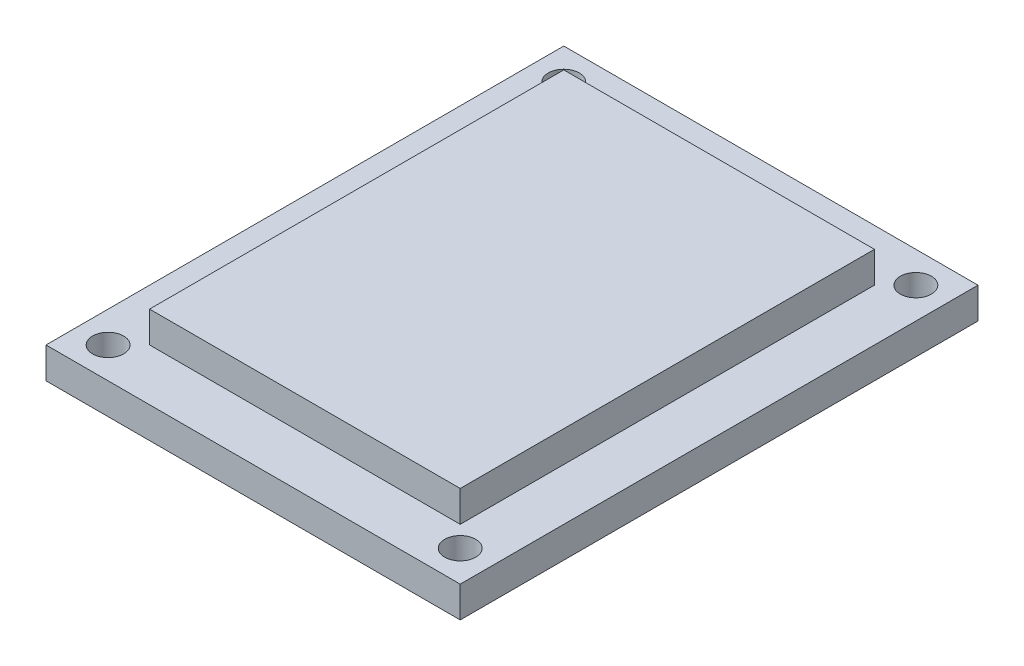
ISO-10303-21;
HEADER;
FILE_DESCRIPTION(('STEP AP214'),'2;1');
FILE_NAME('part.step','',(''),(''),'','','');
FILE_SCHEMA(('AUTOMOTIVE_DESIGN { 1 0 10303 214 1 1 1 1 }'));
ENDSEC;
DATA;
#1=APPLICATION_CONTEXT('core data for automotive mechanical design processes');
#2=APPLICATION_PROTOCOL_DEFINITION('international standard','automotive_design',2000,#1);
#3=PRODUCT_CONTEXT('',#1,'mechanical');
#4=PRODUCT('Part','Part','',(#3));
#5=PRODUCT_RELATED_PRODUCT_CATEGORY('part','',(#4));
#6=PRODUCT_DEFINITION_FORMATION('','',#4);
#7=PRODUCT_DEFINITION_CONTEXT('part definition',#1,'design');
#8=PRODUCT_DEFINITION('design','',#6,#7);
#9=PRODUCT_DEFINITION_SHAPE('','',#8);
#10=(LENGTH_UNIT() NAMED_UNIT(*) SI_UNIT(.MILLI.,.METRE.));
#11=(NAMED_UNIT(*) PLANE_ANGLE_UNIT() SI_UNIT($,.RADIAN.));
#12=(NAMED_UNIT(*) SI_UNIT($,.STERADIAN.) SOLID_ANGLE_UNIT());
#13=UNCERTAINTY_MEASURE_WITH_UNIT(LENGTH_MEASURE(1.E-05),#10,'distance_accuracy_value','');
#14=(GEOMETRIC_REPRESENTATION_CONTEXT(3) GLOBAL_UNCERTAINTY_ASSIGNED_CONTEXT((#13)) GLOBAL_UNIT_ASSIGNED_CONTEXT((#10,
#11,#12)) REPRESENTATION_CONTEXT('',''));
#15=CARTESIAN_POINT('',(0.,0.,0.));
#16=DIRECTION('',(0.,0.,1.));
#17=DIRECTION('',(1.,0.,0.));
#18=AXIS2_PLACEMENT_3D('',#15,#16,#17);
#19=CARTESIAN_POINT('',(15.,3.,20.));
#20=DIRECTION('',(-1.,0.,0.));
#21=DIRECTION('',(0.,0.,1.));
#22=AXIS2_PLACEMENT_3D('',#19,#20,#21);
#23=PLANE('',#22);
#24=DIRECTION('',(0.,0.,-1.));
#25=VECTOR('',#24,1.);
#26=CARTESIAN_POINT('',(15.,0.,20.));
#27=LINE('',#26,#25);
#28=CARTESIAN_POINT('',(15.,0.,20.));
#29=VERTEX_POINT('',#28);
#30=CARTESIAN_POINT('',(15.,0.,-20.));
#31=VERTEX_POINT('',#30);
#32=EDGE_CURVE('E134',#29,#31,#27,.T.);
#33=ORIENTED_EDGE('',*,*,#32,.T.);
#34=DIRECTION('',(0.,-1.,0.));
#35=VECTOR('',#34,1.);
#36=CARTESIAN_POINT('',(15.,3.,-20.));
#37=LINE('',#36,#35);
#38=CARTESIAN_POINT('',(15.,3.,-20.));
#39=VERTEX_POINT('',#38);
#40=EDGE_CURVE('E11',#39,#31,#37,.T.);
#41=ORIENTED_EDGE('',*,*,#40,.F.);
#42=DIRECTION('',(0.,0.,-1.));
#43=VECTOR('',#42,1.);
#44=CARTESIAN_POINT('',(15.,3.,20.));
#45=LINE('',#44,#43);
#46=CARTESIAN_POINT('',(15.,3.,20.));
#47=VERTEX_POINT('',#46);
#48=EDGE_CURVE('E138',#47,#39,#45,.T.);
#49=ORIENTED_EDGE('',*,*,#48,.F.);
#50=DIRECTION('',(0.,-1.,0.));
#51=VECTOR('',#50,1.);
#52=CARTESIAN_POINT('',(15.,3.,20.));
#53=LINE('',#52,#51);
#54=EDGE_CURVE('E146',#47,#29,#53,.T.);
#55=ORIENTED_EDGE('',*,*,#54,.T.);
#56=EDGE_LOOP('',(#33,#41,#49,#55));
#57=FACE_BOUND('',#56,.T.);
#58=ADVANCED_FACE('F31',(#57),#23,.F.);
#59=CARTESIAN_POINT('',(-15.,3.,-20.));
#60=DIRECTION('',(0.,0.,1.));
#61=DIRECTION('',(1.,0.,0.));
#62=AXIS2_PLACEMENT_3D('',#59,#60,#61);
#63=PLANE('',#62);
#64=DIRECTION('',(-1.,0.,0.));
#65=VECTOR('',#64,1.);
#66=CARTESIAN_POINT('',(-15.,0.,-20.));
#67=LINE('',#66,#65);
#68=CARTESIAN_POINT('',(-15.,0.,-20.));
#69=VERTEX_POINT('',#68);
#70=EDGE_CURVE('E149',#31,#69,#67,.T.);
#71=ORIENTED_EDGE('',*,*,#70,.T.);
#72=DIRECTION('',(0.,-1.,0.));
#73=VECTOR('',#72,1.);
#74=CARTESIAN_POINT('',(-15.,3.,-20.));
#75=LINE('',#74,#73);
#76=CARTESIAN_POINT('',(-15.,3.,-20.));
#77=VERTEX_POINT('',#76);
#78=EDGE_CURVE('E39',#77,#69,#75,.T.);
#79=ORIENTED_EDGE('',*,*,#78,.F.);
#80=DIRECTION('',(-1.,0.,0.));
#81=VECTOR('',#80,1.);
#82=CARTESIAN_POINT('',(-15.,3.,-20.));
#83=LINE('',#82,#81);
#84=EDGE_CURVE('E140',#39,#77,#83,.T.);
#85=ORIENTED_EDGE('',*,*,#84,.F.);
#86=ORIENTED_EDGE('',*,*,#40,.T.);
#87=EDGE_LOOP('',(#71,#79,#85,#86));
#88=FACE_BOUND('',#87,.T.);
#89=ADVANCED_FACE('F168',(#88),#63,.F.);
#90=CARTESIAN_POINT('',(-15.,3.,20.));
#91=DIRECTION('',(1.,0.,0.));
#92=DIRECTION('',(0.,0.,-1.));
#93=AXIS2_PLACEMENT_3D('',#90,#91,#92);
#94=PLANE('',#93);
#95=DIRECTION('',(0.,0.,1.));
#96=VECTOR('',#95,1.);
#97=CARTESIAN_POINT('',(-15.,0.,20.));
#98=LINE('',#97,#96);
#99=CARTESIAN_POINT('',(-15.,0.,20.));
#100=VERTEX_POINT('',#99);
#101=EDGE_CURVE('E152',#69,#100,#98,.T.);
#102=ORIENTED_EDGE('',*,*,#101,.T.);
#103=DIRECTION('',(0.,-1.,0.));
#104=VECTOR('',#103,1.);
#105=CARTESIAN_POINT('',(-15.,3.,20.));
#106=LINE('',#105,#104);
#107=CARTESIAN_POINT('',(-15.,3.,20.));
#108=VERTEX_POINT('',#107);
#109=EDGE_CURVE('E159',#108,#100,#106,.T.);
#110=ORIENTED_EDGE('',*,*,#109,.F.);
#111=DIRECTION('',(0.,0.,1.));
#112=VECTOR('',#111,1.);
#113=CARTESIAN_POINT('',(-15.,3.,20.));
#114=LINE('',#113,#112);
#115=EDGE_CURVE('E143',#77,#108,#114,.T.);
#116=ORIENTED_EDGE('',*,*,#115,.F.);
#117=ORIENTED_EDGE('',*,*,#78,.T.);
#118=EDGE_LOOP('',(#102,#110,#116,#117));
#119=FACE_BOUND('',#118,.T.);
#120=ADVANCED_FACE('F165',(#119),#94,.F.);
#121=CARTESIAN_POINT('',(-15.,3.,20.));
#122=DIRECTION('',(0.,0.,-1.));
#123=DIRECTION('',(-1.,0.,0.));
#124=AXIS2_PLACEMENT_3D('',#121,#122,#123);
#125=PLANE('',#124);
#126=DIRECTION('',(1.,0.,0.));
#127=VECTOR('',#126,1.);
#128=CARTESIAN_POINT('',(-15.,0.,20.));
#129=LINE('',#128,#127);
#130=EDGE_CURVE('E141',#100,#29,#129,.T.);
#131=ORIENTED_EDGE('',*,*,#130,.T.);
#132=ORIENTED_EDGE('',*,*,#54,.F.);
#133=DIRECTION('',(1.,0.,0.));
#134=VECTOR('',#133,1.);
#135=CARTESIAN_POINT('',(-15.,3.,20.));
#136=LINE('',#135,#134);
#137=EDGE_CURVE('E46',#108,#47,#136,.T.);
#138=ORIENTED_EDGE('',*,*,#137,.F.);
#139=ORIENTED_EDGE('',*,*,#109,.T.);
#140=EDGE_LOOP('',(#131,#132,#138,#139));
#141=FACE_BOUND('',#140,.T.);
#142=ADVANCED_FACE('F174',(#141),#125,.F.);
#143=CARTESIAN_POINT('',(15.,3.,-20.));
#144=DIRECTION('',(0.,-1.,0.));
#145=DIRECTION('',(0.,0.,-1.));
#146=AXIS2_PLACEMENT_3D('',#143,#144,#145);
#147=PLANE('',#146);
#148=ORIENTED_EDGE('',*,*,#48,.T.);
#149=ORIENTED_EDGE('',*,*,#84,.T.);
#150=ORIENTED_EDGE('',*,*,#115,.T.);
#151=ORIENTED_EDGE('',*,*,#137,.T.);
#152=EDGE_LOOP('',(#148,#149,#150,#151));
#153=FACE_BOUND('',#152,.T.);
#154=ADVANCED_FACE('F177',(#153),#147,.F.);
#155=CARTESIAN_POINT('',(20.,0.,25.));
#156=DIRECTION('',(0.,1.,0.));
#157=DIRECTION('',(0.,0.,1.));
#158=AXIS2_PLACEMENT_3D('',#155,#156,#157);
#159=PLANE('',#158);
#160=DIRECTION('',(1.,0.,0.));
#161=VECTOR('',#160,1.);
#162=CARTESIAN_POINT('',(-20.,0.,25.));
#163=LINE('',#162,#161);
#164=CARTESIAN_POINT('',(-20.,0.,25.));
#165=VERTEX_POINT('',#164);
#166=CARTESIAN_POINT('',(20.,0.,25.));
#167=VERTEX_POINT('',#166);
#168=EDGE_CURVE('E127',#165,#167,#163,.T.);
#169=ORIENTED_EDGE('',*,*,#168,.T.);
#170=DIRECTION('',(0.,0.,-1.));
#171=VECTOR('',#170,1.);
#172=CARTESIAN_POINT('',(20.,0.,25.));
#173=LINE('',#172,#171);
#174=CARTESIAN_POINT('',(20.,0.,-25.));
#175=VERTEX_POINT('',#174);
#176=EDGE_CURVE('E96',#167,#175,#173,.T.);
#177=ORIENTED_EDGE('',*,*,#176,.T.);
#178=DIRECTION('',(-1.,0.,0.));
#179=VECTOR('',#178,1.);
#180=CARTESIAN_POINT('',(20.,0.,-25.));
#181=LINE('',#180,#179);
#182=CARTESIAN_POINT('',(-20.,0.,-25.));
#183=VERTEX_POINT('',#182);
#184=EDGE_CURVE('E119',#175,#183,#181,.T.);
#185=ORIENTED_EDGE('',*,*,#184,.T.);
#186=DIRECTION('',(0.,0.,1.));
#187=VECTOR('',#186,1.);
#188=CARTESIAN_POINT('',(-20.,0.,-25.));
#189=LINE('',#188,#187);
#190=EDGE_CURVE('E116',#183,#165,#189,.T.);
#191=ORIENTED_EDGE('',*,*,#190,.T.);
#192=EDGE_LOOP('',(#169,#177,#185,#191));
#193=FACE_BOUND('',#192,.T.);
#194=CARTESIAN_POINT('',(-17.,0.,-21.9980384868492));
#195=DIRECTION('',(0.,1.,0.));
#196=DIRECTION('',(0.,0.,1.));
#197=AXIS2_PLACEMENT_3D('',#194,#195,#196);
#198=CIRCLE('',#197,1.5);
#199=CARTESIAN_POINT('',(-17.,0.,-20.4980384868492));
#200=VERTEX_POINT('',#199);
#201=EDGE_CURVE('E122',#200,#200,#198,.T.);
#202=ORIENTED_EDGE('',*,*,#201,.F.);
#203=EDGE_LOOP('',(#202));
#204=FACE_BOUND('',#203,.T.);
#205=CARTESIAN_POINT('',(17.,0.,-22.));
#206=DIRECTION('',(0.,1.,0.));
#207=DIRECTION('',(0.,0.,1.));
#208=AXIS2_PLACEMENT_3D('',#205,#206,#207);
#209=CIRCLE('',#208,1.5);
#210=CARTESIAN_POINT('',(17.,0.,-20.5));
#211=VERTEX_POINT('',#210);
#212=EDGE_CURVE('E312',#211,#211,#209,.T.);
#213=ORIENTED_EDGE('',*,*,#212,.F.);
#214=EDGE_LOOP('',(#213));
#215=FACE_BOUND('',#214,.T.);
#216=CARTESIAN_POINT('',(17.,0.,22.));
#217=DIRECTION('',(0.,1.,0.));
#218=DIRECTION('',(0.,0.,1.));
#219=AXIS2_PLACEMENT_3D('',#216,#217,#218);
#220=CIRCLE('',#219,1.5);
#221=CARTESIAN_POINT('',(17.,0.,23.5));
#222=VERTEX_POINT('',#221);
#223=EDGE_CURVE('E306',#222,#222,#220,.T.);
#224=ORIENTED_EDGE('',*,*,#223,.F.);
#225=EDGE_LOOP('',(#224));
#226=FACE_BOUND('',#225,.T.);
#227=CARTESIAN_POINT('',(-17.,0.,22.));
#228=DIRECTION('',(0.,1.,0.));
#229=DIRECTION('',(0.,0.,1.));
#230=AXIS2_PLACEMENT_3D('',#227,#228,#229);
#231=CIRCLE('',#230,1.5);
#232=CARTESIAN_POINT('',(-17.,0.,23.5));
#233=VERTEX_POINT('',#232);
#234=EDGE_CURVE('E303',#233,#233,#231,.T.);
#235=ORIENTED_EDGE('',*,*,#234,.F.);
#236=EDGE_LOOP('',(#235));
#237=FACE_BOUND('',#236,.T.);
#238=ORIENTED_EDGE('',*,*,#32,.F.);
#239=ORIENTED_EDGE('',*,*,#130,.F.);
#240=ORIENTED_EDGE('',*,*,#101,.F.);
#241=ORIENTED_EDGE('',*,*,#70,.F.);
#242=EDGE_LOOP('',(#238,#239,#240,#241));
#243=FACE_BOUND('',#242,.T.);
#244=ADVANCED_FACE('F172',(#193,#204,#215,#226,#237,#243),#159,.T.);
#245=CARTESIAN_POINT('',(-20.,-3.,25.));
#246=DIRECTION('',(0.,0.,1.));
#247=DIRECTION('',(1.,0.,0.));
#248=AXIS2_PLACEMENT_3D('',#245,#246,#247);
#249=PLANE('',#248);
#250=ORIENTED_EDGE('',*,*,#168,.F.);
#251=DIRECTION('',(0.,1.,0.));
#252=VECTOR('',#251,1.);
#253=CARTESIAN_POINT('',(-20.,-3.,25.));
#254=LINE('',#253,#252);
#255=CARTESIAN_POINT('',(-20.,-3.,25.));
#256=VERTEX_POINT('',#255);
#257=EDGE_CURVE('E115',#256,#165,#254,.T.);
#258=ORIENTED_EDGE('',*,*,#257,.F.);
#259=DIRECTION('',(1.,0.,0.));
#260=VECTOR('',#259,1.);
#261=CARTESIAN_POINT('',(-20.,-3.,25.));
#262=LINE('',#261,#260);
#263=CARTESIAN_POINT('',(20.,-3.,25.));
#264=VERTEX_POINT('',#263);
#265=EDGE_CURVE('E109',#256,#264,#262,.T.);
#266=ORIENTED_EDGE('',*,*,#265,.T.);
#267=DIRECTION('',(0.,1.,0.));
#268=VECTOR('',#267,1.);
#269=CARTESIAN_POINT('',(20.,-3.,25.));
#270=LINE('',#269,#268);
#271=EDGE_CURVE('E91',#264,#167,#270,.T.);
#272=ORIENTED_EDGE('',*,*,#271,.T.);
#273=EDGE_LOOP('',(#250,#258,#266,#272));
#274=FACE_BOUND('',#273,.T.);
#275=ADVANCED_FACE('F114',(#274),#249,.T.);
#276=CARTESIAN_POINT('',(-20.,-3.,-25.));
#277=DIRECTION('',(-1.,0.,0.));
#278=DIRECTION('',(0.,0.,1.));
#279=AXIS2_PLACEMENT_3D('',#276,#277,#278);
#280=PLANE('',#279);
#281=ORIENTED_EDGE('',*,*,#190,.F.);
#282=DIRECTION('',(0.,1.,0.));
#283=VECTOR('',#282,1.);
#284=CARTESIAN_POINT('',(-20.,-3.,-25.));
#285=LINE('',#284,#283);
#286=CARTESIAN_POINT('',(-20.,-3.,-25.));
#287=VERTEX_POINT('',#286);
#288=EDGE_CURVE('E135',#287,#183,#285,.T.);
#289=ORIENTED_EDGE('',*,*,#288,.F.);
#290=DIRECTION('',(0.,0.,1.));
#291=VECTOR('',#290,1.);
#292=CARTESIAN_POINT('',(-20.,-3.,-25.));
#293=LINE('',#292,#291);
#294=EDGE_CURVE('E102',#287,#256,#293,.T.);
#295=ORIENTED_EDGE('',*,*,#294,.T.);
#296=ORIENTED_EDGE('',*,*,#257,.T.);
#297=EDGE_LOOP('',(#281,#289,#295,#296));
#298=FACE_BOUND('',#297,.T.);
#299=ADVANCED_FACE('F218',(#298),#280,.T.);
#300=CARTESIAN_POINT('',(20.,-3.,-25.));
#301=DIRECTION('',(0.,0.,-1.));
#302=DIRECTION('',(-1.,0.,0.));
#303=AXIS2_PLACEMENT_3D('',#300,#301,#302);
#304=PLANE('',#303);
#305=ORIENTED_EDGE('',*,*,#184,.F.);
#306=DIRECTION('',(0.,1.,0.));
#307=VECTOR('',#306,1.);
#308=CARTESIAN_POINT('',(20.,-3.,-25.));
#309=LINE('',#308,#307);
#310=CARTESIAN_POINT('',(20.,-3.,-25.));
#311=VERTEX_POINT('',#310);
#312=EDGE_CURVE('E101',#311,#175,#309,.T.);
#313=ORIENTED_EDGE('',*,*,#312,.F.);
#314=DIRECTION('',(-1.,0.,0.));
#315=VECTOR('',#314,1.);
#316=CARTESIAN_POINT('',(20.,-3.,-25.));
#317=LINE('',#316,#315);
#318=EDGE_CURVE('E112',#311,#287,#317,.T.);
#319=ORIENTED_EDGE('',*,*,#318,.T.);
#320=ORIENTED_EDGE('',*,*,#288,.T.);
#321=EDGE_LOOP('',(#305,#313,#319,#320));
#322=FACE_BOUND('',#321,.T.);
#323=ADVANCED_FACE('F226',(#322),#304,.T.);
#324=CARTESIAN_POINT('',(20.,-3.,25.));
#325=DIRECTION('',(1.,0.,0.));
#326=DIRECTION('',(0.,0.,-1.));
#327=AXIS2_PLACEMENT_3D('',#324,#325,#326);
#328=PLANE('',#327);
#329=ORIENTED_EDGE('',*,*,#176,.F.);
#330=ORIENTED_EDGE('',*,*,#271,.F.);
#331=DIRECTION('',(0.,0.,-1.));
#332=VECTOR('',#331,1.);
#333=CARTESIAN_POINT('',(20.,-3.,25.));
#334=LINE('',#333,#332);
#335=EDGE_CURVE('E94',#264,#311,#334,.T.);
#336=ORIENTED_EDGE('',*,*,#335,.T.);
#337=ORIENTED_EDGE('',*,*,#312,.T.);
#338=EDGE_LOOP('',(#329,#330,#336,#337));
#339=FACE_BOUND('',#338,.T.);
#340=ADVANCED_FACE('F93',(#339),#328,.T.);
#341=CARTESIAN_POINT('',(20.,-3.,25.));
#342=DIRECTION('',(0.,1.,0.));
#343=DIRECTION('',(0.,0.,1.));
#344=AXIS2_PLACEMENT_3D('',#341,#342,#343);
#345=PLANE('',#344);
#346=CARTESIAN_POINT('',(-17.,-3.,22.));
#347=DIRECTION('',(0.,1.,0.));
#348=DIRECTION('',(0.,0.,1.));
#349=AXIS2_PLACEMENT_3D('',#346,#347,#348);
#350=CIRCLE('',#349,1.5);
#351=CARTESIAN_POINT('',(-17.,-3.,23.5));
#352=VERTEX_POINT('',#351);
#353=EDGE_CURVE('E300',#352,#352,#350,.T.);
#354=ORIENTED_EDGE('',*,*,#353,.T.);
#355=EDGE_LOOP('',(#354));
#356=FACE_BOUND('',#355,.T.);
#357=CARTESIAN_POINT('',(17.,-3.,22.));
#358=DIRECTION('',(0.,1.,0.));
#359=DIRECTION('',(0.,0.,1.));
#360=AXIS2_PLACEMENT_3D('',#357,#358,#359);
#361=CIRCLE('',#360,1.5);
#362=CARTESIAN_POINT('',(17.,-3.,23.5));
#363=VERTEX_POINT('',#362);
#364=EDGE_CURVE('E309',#363,#363,#361,.T.);
#365=ORIENTED_EDGE('',*,*,#364,.T.);
#366=EDGE_LOOP('',(#365));
#367=FACE_BOUND('',#366,.T.);
#368=CARTESIAN_POINT('',(17.,-3.,-22.));
#369=DIRECTION('',(0.,1.,0.));
#370=DIRECTION('',(0.,0.,1.));
#371=AXIS2_PLACEMENT_3D('',#368,#369,#370);
#372=CIRCLE('',#371,1.5);
#373=CARTESIAN_POINT('',(17.,-3.,-20.5));
#374=VERTEX_POINT('',#373);
#375=EDGE_CURVE('E315',#374,#374,#372,.T.);
#376=ORIENTED_EDGE('',*,*,#375,.T.);
#377=EDGE_LOOP('',(#376));
#378=FACE_BOUND('',#377,.T.);
#379=CARTESIAN_POINT('',(-17.,-3.,-21.9980384868492));
#380=DIRECTION('',(0.,1.,0.));
#381=DIRECTION('',(0.,0.,1.));
#382=AXIS2_PLACEMENT_3D('',#379,#380,#381);
#383=CIRCLE('',#382,1.5);
#384=CARTESIAN_POINT('',(-17.,-3.,-20.4980384868492));
#385=VERTEX_POINT('',#384);
#386=EDGE_CURVE('E129',#385,#385,#383,.T.);
#387=ORIENTED_EDGE('',*,*,#386,.T.);
#388=EDGE_LOOP('',(#387));
#389=FACE_BOUND('',#388,.T.);
#390=ORIENTED_EDGE('',*,*,#265,.F.);
#391=ORIENTED_EDGE('',*,*,#294,.F.);
#392=ORIENTED_EDGE('',*,*,#318,.F.);
#393=ORIENTED_EDGE('',*,*,#335,.F.);
#394=EDGE_LOOP('',(#390,#391,#392,#393));
#395=FACE_BOUND('',#394,.T.);
#396=ADVANCED_FACE('F107',(#356,#367,#378,#389,#395),#345,.F.);
#397=CARTESIAN_POINT('',(-17.,-3.,-21.9980384868492));
#398=DIRECTION('',(0.,1.,0.));
#399=DIRECTION('',(0.,0.,1.));
#400=AXIS2_PLACEMENT_3D('',#397,#398,#399);
#401=CYLINDRICAL_SURFACE('',#400,1.5);
#402=ORIENTED_EDGE('',*,*,#386,.F.);
#403=EDGE_LOOP('',(#402));
#404=FACE_BOUND('',#403,.T.);
#405=ORIENTED_EDGE('',*,*,#201,.T.);
#406=EDGE_LOOP('',(#405));
#407=FACE_BOUND('',#406,.T.);
#408=ADVANCED_FACE('F253',(#404,#407),#401,.F.);
#409=CARTESIAN_POINT('',(17.,-3.,-22.));
#410=DIRECTION('',(0.,1.,0.));
#411=DIRECTION('',(0.,0.,1.));
#412=AXIS2_PLACEMENT_3D('',#409,#410,#411);
#413=CYLINDRICAL_SURFACE('',#412,1.5);
#414=ORIENTED_EDGE('',*,*,#375,.F.);
#415=EDGE_LOOP('',(#414));
#416=FACE_BOUND('',#415,.T.);
#417=ORIENTED_EDGE('',*,*,#212,.T.);
#418=EDGE_LOOP('',(#417));
#419=FACE_BOUND('',#418,.T.);
#420=ADVANCED_FACE('F263',(#416,#419),#413,.F.);
#421=CARTESIAN_POINT('',(17.,-3.,22.));
#422=DIRECTION('',(0.,1.,0.));
#423=DIRECTION('',(0.,0.,1.));
#424=AXIS2_PLACEMENT_3D('',#421,#422,#423);
#425=CYLINDRICAL_SURFACE('',#424,1.5);
#426=ORIENTED_EDGE('',*,*,#364,.F.);
#427=EDGE_LOOP('',(#426));
#428=FACE_BOUND('',#427,.T.);
#429=ORIENTED_EDGE('',*,*,#223,.T.);
#430=EDGE_LOOP('',(#429));
#431=FACE_BOUND('',#430,.T.);
#432=ADVANCED_FACE('F273',(#428,#431),#425,.F.);
#433=CARTESIAN_POINT('',(-17.,-3.,22.));
#434=DIRECTION('',(0.,1.,0.));
#435=DIRECTION('',(0.,0.,1.));
#436=AXIS2_PLACEMENT_3D('',#433,#434,#435);
#437=CYLINDRICAL_SURFACE('',#436,1.5);
#438=ORIENTED_EDGE('',*,*,#353,.F.);
#439=EDGE_LOOP('',(#438));
#440=FACE_BOUND('',#439,.T.);
#441=ORIENTED_EDGE('',*,*,#234,.T.);
#442=EDGE_LOOP('',(#441));
#443=FACE_BOUND('',#442,.T.);
#444=ADVANCED_FACE('F283',(#440,#443),#437,.F.);
#445=CLOSED_SHELL('',(#58,#89,#120,#142,#154,#244,#275,#299,#323,#340,#396,#408,#420,#432,#444));
#446=MANIFOLD_SOLID_BREP('B2',#445);
#447=ADVANCED_BREP_SHAPE_REPRESENTATION('',(#18,#446),#14);
#448=SHAPE_DEFINITION_REPRESENTATION(#9,#447);
ENDSEC;
END-ISO-10303-21;
